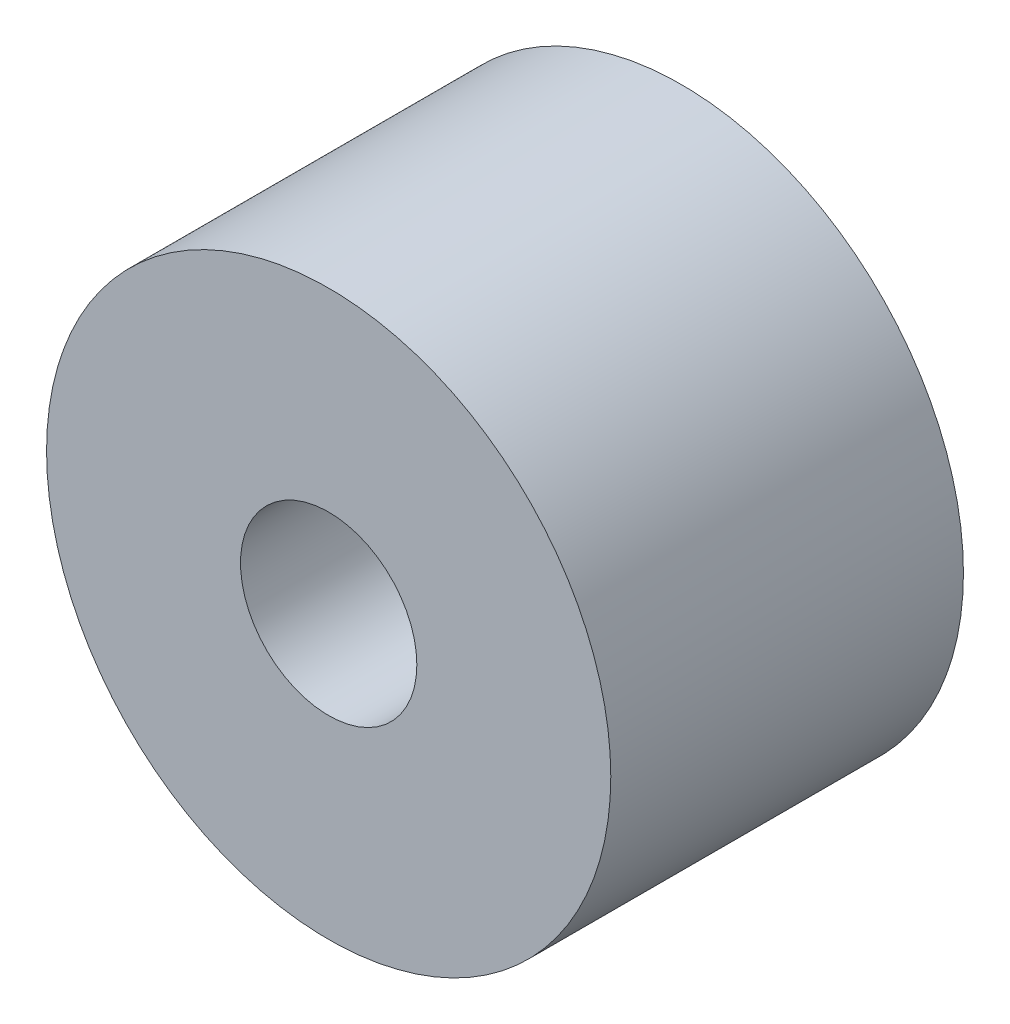
ISO-10303-21;
HEADER;
FILE_DESCRIPTION(('STEP AP214'),'2;1');
FILE_NAME('part.step','',(''),(''),'','','');
FILE_SCHEMA(('AUTOMOTIVE_DESIGN { 1 0 10303 214 1 1 1 1 }'));
ENDSEC;
DATA;
#1=APPLICATION_CONTEXT('core data for automotive mechanical design processes');
#2=APPLICATION_PROTOCOL_DEFINITION('international standard','automotive_design',2000,#1);
#3=PRODUCT_CONTEXT('',#1,'mechanical');
#4=PRODUCT('Part','Part','',(#3));
#5=PRODUCT_RELATED_PRODUCT_CATEGORY('part','',(#4));
#6=PRODUCT_DEFINITION_FORMATION('','',#4);
#7=PRODUCT_DEFINITION_CONTEXT('part definition',#1,'design');
#8=PRODUCT_DEFINITION('design','',#6,#7);
#9=PRODUCT_DEFINITION_SHAPE('','',#8);
#10=(LENGTH_UNIT() NAMED_UNIT(*) SI_UNIT(.MILLI.,.METRE.));
#11=(NAMED_UNIT(*) PLANE_ANGLE_UNIT() SI_UNIT($,.RADIAN.));
#12=(NAMED_UNIT(*) SI_UNIT($,.STERADIAN.) SOLID_ANGLE_UNIT());
#13=UNCERTAINTY_MEASURE_WITH_UNIT(LENGTH_MEASURE(1.E-05),#10,'distance_accuracy_value','');
#14=(GEOMETRIC_REPRESENTATION_CONTEXT(3) GLOBAL_UNCERTAINTY_ASSIGNED_CONTEXT((#13)) GLOBAL_UNIT_ASSIGNED_CONTEXT((#10,
#11,#12)) REPRESENTATION_CONTEXT('',''));
#15=CARTESIAN_POINT('',(0.,0.,0.));
#16=DIRECTION('',(0.,0.,1.));
#17=DIRECTION('',(1.,0.,0.));
#18=AXIS2_PLACEMENT_3D('',#15,#16,#17);
#19=CARTESIAN_POINT('',(-56.6,-31.0012501953736,13.));
#20=DIRECTION('',(0.,0.,1.));
#21=DIRECTION('',(1.,0.,0.));
#22=AXIS2_PLACEMENT_3D('',#19,#20,#21);
#23=PLANE('',#22);
#24=CARTESIAN_POINT('',(-56.6,-31.0012501953736,13.));
#25=DIRECTION('',(0.,0.,1.));
#26=DIRECTION('',(1.,0.,0.));
#27=AXIS2_PLACEMENT_3D('',#24,#25,#26);
#28=CIRCLE('',#27,4.);
#29=CARTESIAN_POINT('',(-52.6,-31.0012501953736,13.));
#30=VERTEX_POINT('',#29);
#31=EDGE_CURVE('E10',#30,#30,#28,.T.);
#32=ORIENTED_EDGE('',*,*,#31,.T.);
#33=EDGE_LOOP('',(#32));
#34=FACE_BOUND('',#33,.T.);
#35=CARTESIAN_POINT('',(-56.6,-31.0012501953736,13.));
#36=DIRECTION('',(0.,0.,1.));
#37=DIRECTION('',(1.,0.,0.));
#38=AXIS2_PLACEMENT_3D('',#35,#36,#37);
#39=CIRCLE('',#38,1.25);
#40=CARTESIAN_POINT('',(-55.35,-31.0012501953736,13.));
#41=VERTEX_POINT('',#40);
#42=EDGE_CURVE('E44',#41,#41,#39,.T.);
#43=ORIENTED_EDGE('',*,*,#42,.F.);
#44=EDGE_LOOP('',(#43));
#45=FACE_BOUND('',#44,.T.);
#46=ADVANCED_FACE('F33',(#34,#45),#23,.T.);
#47=CARTESIAN_POINT('',(-56.6,-31.0012501953736,8.));
#48=DIRECTION('',(0.,0.,1.));
#49=DIRECTION('',(1.,0.,0.));
#50=AXIS2_PLACEMENT_3D('',#47,#48,#49);
#51=PLANE('',#50);
#52=CARTESIAN_POINT('',(-56.6,-31.0012501953736,8.));
#53=DIRECTION('',(0.,0.,1.));
#54=DIRECTION('',(1.,0.,0.));
#55=AXIS2_PLACEMENT_3D('',#52,#53,#54);
#56=CIRCLE('',#55,4.);
#57=CARTESIAN_POINT('',(-52.6,-31.0012501953736,8.));
#58=VERTEX_POINT('',#57);
#59=EDGE_CURVE('E37',#58,#58,#56,.T.);
#60=ORIENTED_EDGE('',*,*,#59,.F.);
#61=EDGE_LOOP('',(#60));
#62=FACE_BOUND('',#61,.T.);
#63=CARTESIAN_POINT('',(-56.6,-31.0012501953736,8.));
#64=DIRECTION('',(0.,0.,1.));
#65=DIRECTION('',(1.,0.,0.));
#66=AXIS2_PLACEMENT_3D('',#63,#64,#65);
#67=CIRCLE('',#66,1.25);
#68=CARTESIAN_POINT('',(-55.35,-31.0012501953736,8.));
#69=VERTEX_POINT('',#68);
#70=EDGE_CURVE('E46',#69,#69,#67,.T.);
#71=ORIENTED_EDGE('',*,*,#70,.T.);
#72=EDGE_LOOP('',(#71));
#73=FACE_BOUND('',#72,.T.);
#74=ADVANCED_FACE('F56',(#62,#73),#51,.F.);
#75=CARTESIAN_POINT('',(-56.6,-31.0012501953736,13.));
#76=DIRECTION('',(0.,0.,-1.));
#77=DIRECTION('',(-1.,0.,0.));
#78=AXIS2_PLACEMENT_3D('',#75,#76,#77);
#79=CYLINDRICAL_SURFACE('',#78,4.);
#80=ORIENTED_EDGE('',*,*,#31,.F.);
#81=EDGE_LOOP('',(#80));
#82=FACE_BOUND('',#81,.T.);
#83=ORIENTED_EDGE('',*,*,#59,.T.);
#84=EDGE_LOOP('',(#83));
#85=FACE_BOUND('',#84,.T.);
#86=ADVANCED_FACE('F35',(#82,#85),#79,.T.);
#87=CARTESIAN_POINT('',(-56.6,-31.0012501953736,13.));
#88=DIRECTION('',(0.,0.,-1.));
#89=DIRECTION('',(-1.,0.,0.));
#90=AXIS2_PLACEMENT_3D('',#87,#88,#89);
#91=CYLINDRICAL_SURFACE('',#90,1.25);
#92=ORIENTED_EDGE('',*,*,#42,.T.);
#93=EDGE_LOOP('',(#92));
#94=FACE_BOUND('',#93,.T.);
#95=ORIENTED_EDGE('',*,*,#70,.F.);
#96=EDGE_LOOP('',(#95));
#97=FACE_BOUND('',#96,.T.);
#98=ADVANCED_FACE('F52',(#94,#97),#91,.F.);
#99=CLOSED_SHELL('',(#46,#74,#86,#98));
#100=MANIFOLD_SOLID_BREP('B2',#99);
#101=ADVANCED_BREP_SHAPE_REPRESENTATION('',(#18,#100),#14);
#102=SHAPE_DEFINITION_REPRESENTATION(#9,#101);
ENDSEC;
END-ISO-10303-21;
